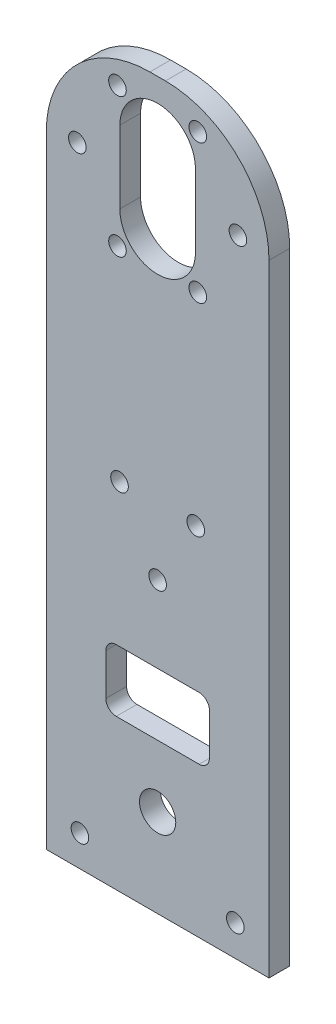
ISO-10303-21;
HEADER;
FILE_DESCRIPTION(('STEP AP214'),'2;1');
FILE_NAME('part.step','',(''),(''),'','','');
FILE_SCHEMA(('AUTOMOTIVE_DESIGN { 1 0 10303 214 1 1 1 1 }'));
ENDSEC;
DATA;
#1=APPLICATION_CONTEXT('core data for automotive mechanical design processes');
#2=APPLICATION_PROTOCOL_DEFINITION('international standard','automotive_design',2000,#1);
#3=PRODUCT_CONTEXT('',#1,'mechanical');
#4=PRODUCT('Part','Part','',(#3));
#5=PRODUCT_RELATED_PRODUCT_CATEGORY('part','',(#4));
#6=PRODUCT_DEFINITION_FORMATION('','',#4);
#7=PRODUCT_DEFINITION_CONTEXT('part definition',#1,'design');
#8=PRODUCT_DEFINITION('design','',#6,#7);
#9=PRODUCT_DEFINITION_SHAPE('','',#8);
#10=(LENGTH_UNIT() NAMED_UNIT(*) SI_UNIT(.MILLI.,.METRE.));
#11=(NAMED_UNIT(*) PLANE_ANGLE_UNIT() SI_UNIT($,.RADIAN.));
#12=(NAMED_UNIT(*) SI_UNIT($,.STERADIAN.) SOLID_ANGLE_UNIT());
#13=UNCERTAINTY_MEASURE_WITH_UNIT(LENGTH_MEASURE(1.E-05),#10,'distance_accuracy_value','');
#14=(GEOMETRIC_REPRESENTATION_CONTEXT(3) GLOBAL_UNCERTAINTY_ASSIGNED_CONTEXT((#13)) GLOBAL_UNIT_ASSIGNED_CONTEXT((#10,
#11,#12)) REPRESENTATION_CONTEXT('',''));
#15=CARTESIAN_POINT('',(0.,0.,0.));
#16=DIRECTION('',(0.,0.,1.));
#17=DIRECTION('',(1.,0.,0.));
#18=AXIS2_PLACEMENT_3D('',#15,#16,#17);
#19=CARTESIAN_POINT('',(0.,0.,4.));
#20=DIRECTION('',(0.,0.,1.));
#21=DIRECTION('',(1.,0.,0.));
#22=AXIS2_PLACEMENT_3D('',#19,#20,#21);
#23=PLANE('',#22);
#24=CARTESIAN_POINT('',(-0.99999999999988,-64.4016590441318,4.));
#25=DIRECTION('',(0.,0.,1.));
#26=DIRECTION('',(1.,0.,0.));
#27=AXIS2_PLACEMENT_3D('',#24,#25,#26);
#28=CIRCLE('',#27,1.70000000006136);
#29=CARTESIAN_POINT('',(0.700000000061478,-64.4016590441318,4.));
#30=VERTEX_POINT('',#29);
#31=EDGE_CURVE('E358',#30,#30,#28,.T.);
#32=ORIENTED_EDGE('',*,*,#31,.F.);
#33=EDGE_LOOP('',(#32));
#34=FACE_BOUND('',#33,.T.);
#35=CARTESIAN_POINT('',(6.36121593216787,-51.6516590441318,4.));
#36=DIRECTION('',(0.,0.,1.));
#37=DIRECTION('',(1.,0.,0.));
#38=AXIS2_PLACEMENT_3D('',#35,#36,#37);
#39=CIRCLE('',#38,1.70000000006138);
#40=CARTESIAN_POINT('',(8.06121593222925,-51.6516590441318,4.));
#41=VERTEX_POINT('',#40);
#42=EDGE_CURVE('E375',#41,#41,#39,.T.);
#43=ORIENTED_EDGE('',*,*,#42,.F.);
#44=EDGE_LOOP('',(#43));
#45=FACE_BOUND('',#44,.T.);
#46=CARTESIAN_POINT('',(-8.36121593216755,-51.6516590441317,4.));
#47=DIRECTION('',(0.,0.,1.));
#48=DIRECTION('',(1.,0.,0.));
#49=AXIS2_PLACEMENT_3D('',#46,#47,#48);
#50=CIRCLE('',#49,1.70000000006137);
#51=CARTESIAN_POINT('',(-6.66121593210618,-51.6516590441317,4.));
#52=VERTEX_POINT('',#51);
#53=EDGE_CURVE('E372',#52,#52,#50,.T.);
#54=ORIENTED_EDGE('',*,*,#53,.F.);
#55=EDGE_LOOP('',(#54));
#56=FACE_BOUND('',#55,.T.);
#57=DIRECTION('',(0.,1.,0.));
#58=VECTOR('',#57,1.);
#59=CARTESIAN_POINT('',(9.00000000000006,-89.2,4.));
#60=LINE('',#59,#58);
#61=CARTESIAN_POINT('',(9.00000000000006,-89.2,4.));
#62=VERTEX_POINT('',#61);
#63=CARTESIAN_POINT('',(9.00000000000006,-81.2,4.));
#64=VERTEX_POINT('',#63);
#65=EDGE_CURVE('E176',#62,#64,#60,.T.);
#66=ORIENTED_EDGE('',*,*,#65,.F.);
#67=CARTESIAN_POINT('',(7.00000000000005,-89.2,4.));
#68=DIRECTION('',(0.,0.,1.));
#69=DIRECTION('',(-1.,0.,0.));
#70=AXIS2_PLACEMENT_3D('',#67,#68,#69);
#71=CIRCLE('',#70,1.99999999999999);
#72=CARTESIAN_POINT('',(7.00000000000005,-91.2,4.));
#73=VERTEX_POINT('',#72);
#74=EDGE_CURVE('E166',#73,#62,#71,.T.);
#75=ORIENTED_EDGE('',*,*,#74,.F.);
#76=DIRECTION('',(1.,0.,0.));
#77=VECTOR('',#76,1.);
#78=CARTESIAN_POINT('',(-8.99999999999994,-91.2,4.));
#79=LINE('',#78,#77);
#80=CARTESIAN_POINT('',(-8.99999999999994,-91.2,4.));
#81=VERTEX_POINT('',#80);
#82=EDGE_CURVE('E204',#81,#73,#79,.T.);
#83=ORIENTED_EDGE('',*,*,#82,.F.);
#84=CARTESIAN_POINT('',(-8.99999999999994,-89.2,4.));
#85=DIRECTION('',(0.,0.,1.));
#86=DIRECTION('',(1.,0.,0.));
#87=AXIS2_PLACEMENT_3D('',#84,#85,#86);
#88=CIRCLE('',#87,1.99999999999999);
#89=CARTESIAN_POINT('',(-10.9999999999999,-89.2,4.));
#90=VERTEX_POINT('',#89);
#91=EDGE_CURVE('E201',#90,#81,#88,.T.);
#92=ORIENTED_EDGE('',*,*,#91,.F.);
#93=DIRECTION('',(0.,-1.,0.));
#94=VECTOR('',#93,1.);
#95=CARTESIAN_POINT('',(-10.9999999999999,-89.2,4.));
#96=LINE('',#95,#94);
#97=CARTESIAN_POINT('',(-11.,-81.2,4.));
#98=VERTEX_POINT('',#97);
#99=EDGE_CURVE('E199',#98,#90,#96,.T.);
#100=ORIENTED_EDGE('',*,*,#99,.F.);
#101=CARTESIAN_POINT('',(-8.99999999999994,-81.2,4.));
#102=DIRECTION('',(0.,0.,1.));
#103=DIRECTION('',(-1.,0.,0.));
#104=AXIS2_PLACEMENT_3D('',#101,#102,#103);
#105=CIRCLE('',#104,2.00000000000001);
#106=CARTESIAN_POINT('',(-8.99999999999994,-79.2,4.));
#107=VERTEX_POINT('',#106);
#108=EDGE_CURVE('E197',#107,#98,#105,.T.);
#109=ORIENTED_EDGE('',*,*,#108,.F.);
#110=DIRECTION('',(-1.,0.,0.));
#111=VECTOR('',#110,1.);
#112=CARTESIAN_POINT('',(-8.99999999999994,-79.2,4.));
#113=LINE('',#112,#111);
#114=CARTESIAN_POINT('',(7.00000000000005,-79.2,4.));
#115=VERTEX_POINT('',#114);
#116=EDGE_CURVE('E192',#115,#107,#113,.T.);
#117=ORIENTED_EDGE('',*,*,#116,.F.);
#118=CARTESIAN_POINT('',(7.00000000000005,-81.2,4.));
#119=DIRECTION('',(0.,0.,1.));
#120=DIRECTION('',(-1.,0.,0.));
#121=AXIS2_PLACEMENT_3D('',#118,#119,#120);
#122=CIRCLE('',#121,2.00000000000001);
#123=EDGE_CURVE('E190',#64,#115,#122,.T.);
#124=ORIENTED_EDGE('',*,*,#123,.F.);
#125=EDGE_LOOP('',(#66,#75,#83,#92,#100,#109,#117,#124));
#126=FACE_BOUND('',#125,.T.);
#127=DIRECTION('',(0.,-1.,0.));
#128=VECTOR('',#127,1.);
#129=CARTESIAN_POINT('',(-8.30000000000002,8.00000000000001,4.));
#130=LINE('',#129,#128);
#131=CARTESIAN_POINT('',(-8.30000000000002,8.00000000000001,4.));
#132=VERTEX_POINT('',#131);
#133=CARTESIAN_POINT('',(-8.30000000000005,-5.99999999999999,4.));
#134=VERTEX_POINT('',#133);
#135=EDGE_CURVE('E241',#132,#134,#130,.T.);
#136=ORIENTED_EDGE('',*,*,#135,.F.);
#137=CARTESIAN_POINT('',(-0.99999999999992,8.00000000000001,4.));
#138=DIRECTION('',(0.,0.,1.));
#139=DIRECTION('',(1.,0.,0.));
#140=AXIS2_PLACEMENT_3D('',#137,#138,#139);
#141=CIRCLE('',#140,7.30000000000008);
#142=CARTESIAN_POINT('',(6.30000000000013,8.00000000000001,4.));
#143=VERTEX_POINT('',#142);
#144=EDGE_CURVE('E239',#143,#132,#141,.T.);
#145=ORIENTED_EDGE('',*,*,#144,.F.);
#146=DIRECTION('',(0.,1.,0.));
#147=VECTOR('',#146,1.);
#148=CARTESIAN_POINT('',(6.30000000000013,8.00000000000001,4.));
#149=LINE('',#148,#147);
#150=CARTESIAN_POINT('',(6.30000000000014,-5.99999999999999,4.));
#151=VERTEX_POINT('',#150);
#152=EDGE_CURVE('E247',#151,#143,#149,.T.);
#153=ORIENTED_EDGE('',*,*,#152,.F.);
#154=CARTESIAN_POINT('',(-0.999999999999969,-5.99999999999999,4.));
#155=DIRECTION('',(0.,0.,1.));
#156=DIRECTION('',(1.,0.,0.));
#157=AXIS2_PLACEMENT_3D('',#154,#155,#156);
#158=CIRCLE('',#157,7.30000000000008);
#159=EDGE_CURVE('E244',#134,#151,#158,.T.);
#160=ORIENTED_EDGE('',*,*,#159,.F.);
#161=EDGE_LOOP('',(#136,#145,#153,#160));
#162=FACE_BOUND('',#161,.T.);
#163=CARTESIAN_POINT('',(-15.9999999999999,-114.2,4.));
#164=DIRECTION('',(0.,0.,1.));
#165=DIRECTION('',(1.,0.,0.));
#166=AXIS2_PLACEMENT_3D('',#163,#164,#165);
#167=CIRCLE('',#166,1.7);
#168=CARTESIAN_POINT('',(-14.2999999999999,-114.2,4.));
#169=VERTEX_POINT('',#168);
#170=EDGE_CURVE('E270',#169,#169,#167,.T.);
#171=ORIENTED_EDGE('',*,*,#170,.F.);
#172=EDGE_LOOP('',(#171));
#173=FACE_BOUND('',#172,.T.);
#174=CARTESIAN_POINT('',(14.5,0.999999999999956,4.));
#175=DIRECTION('',(0.,0.,1.));
#176=DIRECTION('',(1.,0.,0.));
#177=AXIS2_PLACEMENT_3D('',#174,#175,#176);
#178=CIRCLE('',#177,1.7);
#179=CARTESIAN_POINT('',(16.2,0.999999999999956,4.));
#180=VERTEX_POINT('',#179);
#181=EDGE_CURVE('E282',#180,#180,#178,.T.);
#182=ORIENTED_EDGE('',*,*,#181,.F.);
#183=EDGE_LOOP('',(#182));
#184=FACE_BOUND('',#183,.T.);
#185=CARTESIAN_POINT('',(-8.75435443094404,14.4259077905375,4.));
#186=DIRECTION('',(0.,0.,1.));
#187=DIRECTION('',(1.,0.,0.));
#188=AXIS2_PLACEMENT_3D('',#185,#186,#187);
#189=CIRCLE('',#188,1.7);
#190=CARTESIAN_POINT('',(-7.05435443094404,14.4259077905375,4.));
#191=VERTEX_POINT('',#190);
#192=EDGE_CURVE('E294',#191,#191,#189,.T.);
#193=ORIENTED_EDGE('',*,*,#192,.F.);
#194=EDGE_LOOP('',(#193));
#195=FACE_BOUND('',#194,.T.);
#196=CARTESIAN_POINT('',(-8.75435443094507,-12.4259077905363,4.));
#197=DIRECTION('',(0.,0.,1.));
#198=DIRECTION('',(1.,0.,0.));
#199=AXIS2_PLACEMENT_3D('',#196,#197,#198);
#200=CIRCLE('',#199,1.7);
#201=CARTESIAN_POINT('',(-7.05435443094506,-12.4259077905363,4.));
#202=VERTEX_POINT('',#201);
#203=EDGE_CURVE('E306',#202,#202,#200,.T.);
#204=ORIENTED_EDGE('',*,*,#203,.F.);
#205=EDGE_LOOP('',(#204));
#206=FACE_BOUND('',#205,.T.);
#207=DIRECTION('',(-1.,0.,0.));
#208=VECTOR('',#207,1.);
#209=CARTESIAN_POINT('',(20.5,19.8,4.));
#210=LINE('',#209,#208);
#211=CARTESIAN_POINT('',(0.500000000000028,19.8,4.));
#212=VERTEX_POINT('',#211);
#213=CARTESIAN_POINT('',(-2.49999999999993,19.8,4.));
#214=VERTEX_POINT('',#213);
#215=EDGE_CURVE('E324',#212,#214,#210,.T.);
#216=ORIENTED_EDGE('',*,*,#215,.T.);
#217=CARTESIAN_POINT('',(-2.49999999999992,-0.199999999999999,4.));
#218=DIRECTION('',(0.,0.,1.));
#219=DIRECTION('',(1.,0.,0.));
#220=AXIS2_PLACEMENT_3D('',#217,#218,#219);
#221=CIRCLE('',#220,20.);
#222=CARTESIAN_POINT('',(-22.4999999999999,-0.200000000000002,4.));
#223=VERTEX_POINT('',#222);
#224=EDGE_CURVE('E46',#214,#223,#221,.T.);
#225=ORIENTED_EDGE('',*,*,#224,.T.);
#226=DIRECTION('',(0.,-1.,0.));
#227=VECTOR('',#226,1.);
#228=CARTESIAN_POINT('',(-22.4999999999999,19.8,4.));
#229=LINE('',#228,#227);
#230=CARTESIAN_POINT('',(-22.4999999999999,-120.2,4.));
#231=VERTEX_POINT('',#230);
#232=EDGE_CURVE('E326',#223,#231,#229,.T.);
#233=ORIENTED_EDGE('',*,*,#232,.T.);
#234=DIRECTION('',(1.,0.,0.));
#235=VECTOR('',#234,1.);
#236=CARTESIAN_POINT('',(20.5,-120.2,4.));
#237=LINE('',#236,#235);
#238=CARTESIAN_POINT('',(20.5,-120.2,4.));
#239=VERTEX_POINT('',#238);
#240=EDGE_CURVE('E318',#231,#239,#237,.T.);
#241=ORIENTED_EDGE('',*,*,#240,.T.);
#242=DIRECTION('',(0.,1.,0.));
#243=VECTOR('',#242,1.);
#244=CARTESIAN_POINT('',(20.5,-120.2,4.));
#245=LINE('',#244,#243);
#246=CARTESIAN_POINT('',(20.5,-0.199999999999992,4.));
#247=VERTEX_POINT('',#246);
#248=EDGE_CURVE('E321',#239,#247,#245,.T.);
#249=ORIENTED_EDGE('',*,*,#248,.T.);
#250=CARTESIAN_POINT('',(0.500000000000032,-0.199999999999999,4.));
#251=DIRECTION('',(0.,0.,1.));
#252=DIRECTION('',(1.,0.,0.));
#253=AXIS2_PLACEMENT_3D('',#250,#251,#252);
#254=CIRCLE('',#253,20.);
#255=EDGE_CURVE('E352',#247,#212,#254,.T.);
#256=ORIENTED_EDGE('',*,*,#255,.T.);
#257=EDGE_LOOP('',(#216,#225,#233,#241,#249,#256));
#258=FACE_BOUND('',#257,.T.);
#259=CARTESIAN_POINT('',(6.74854852301807,-12.4259077905367,4.));
#260=DIRECTION('',(0.,0.,1.));
#261=DIRECTION('',(1.,0.,0.));
#262=AXIS2_PLACEMENT_3D('',#259,#260,#261);
#263=CIRCLE('',#262,1.7);
#264=CARTESIAN_POINT('',(8.44854852301807,-12.4259077905367,4.));
#265=VERTEX_POINT('',#264);
#266=EDGE_CURVE('E312',#265,#265,#263,.T.);
#267=ORIENTED_EDGE('',*,*,#266,.F.);
#268=EDGE_LOOP('',(#267));
#269=FACE_BOUND('',#268,.T.);
#270=CARTESIAN_POINT('',(-16.505805907926,1.00000000000084,4.));
#271=DIRECTION('',(0.,0.,1.));
#272=DIRECTION('',(1.,0.,0.));
#273=AXIS2_PLACEMENT_3D('',#270,#271,#272);
#274=CIRCLE('',#273,1.7);
#275=CARTESIAN_POINT('',(-14.805805907926,1.00000000000084,4.));
#276=VERTEX_POINT('',#275);
#277=EDGE_CURVE('E300',#276,#276,#274,.T.);
#278=ORIENTED_EDGE('',*,*,#277,.F.);
#279=EDGE_LOOP('',(#278));
#280=FACE_BOUND('',#279,.T.);
#281=CARTESIAN_POINT('',(6.74854852301912,14.4259077905371,4.));
#282=DIRECTION('',(0.,0.,1.));
#283=DIRECTION('',(1.,0.,0.));
#284=AXIS2_PLACEMENT_3D('',#281,#282,#283);
#285=CIRCLE('',#284,1.7);
#286=CARTESIAN_POINT('',(8.44854852301913,14.4259077905371,4.));
#287=VERTEX_POINT('',#286);
#288=EDGE_CURVE('E288',#287,#287,#285,.T.);
#289=ORIENTED_EDGE('',*,*,#288,.F.);
#290=EDGE_LOOP('',(#289));
#291=FACE_BOUND('',#290,.T.);
#292=CARTESIAN_POINT('',(14.0000000000001,-114.2,4.));
#293=DIRECTION('',(0.,0.,1.));
#294=DIRECTION('',(1.,0.,0.));
#295=AXIS2_PLACEMENT_3D('',#292,#293,#294);
#296=CIRCLE('',#295,1.7);
#297=CARTESIAN_POINT('',(15.7000000000001,-114.2,4.));
#298=VERTEX_POINT('',#297);
#299=EDGE_CURVE('E276',#298,#298,#296,.T.);
#300=ORIENTED_EDGE('',*,*,#299,.F.);
#301=EDGE_LOOP('',(#300));
#302=FACE_BOUND('',#301,.T.);
#303=CARTESIAN_POINT('',(-0.999999999999931,-103.2,4.));
#304=DIRECTION('',(0.,0.,1.));
#305=DIRECTION('',(1.,0.,0.));
#306=AXIS2_PLACEMENT_3D('',#303,#304,#305);
#307=CIRCLE('',#306,3.5);
#308=CARTESIAN_POINT('',(2.50000000000007,-103.2,4.));
#309=VERTEX_POINT('',#308);
#310=EDGE_CURVE('E208',#309,#309,#307,.T.);
#311=ORIENTED_EDGE('',*,*,#310,.F.);
#312=EDGE_LOOP('',(#311));
#313=FACE_BOUND('',#312,.T.);
#314=ADVANCED_FACE('F37',(#34,#45,#56,#126,#162,#173,#184,#195,#206,#258,#269,#280,#291,#302,
#313),#23,.T.);
#315=CARTESIAN_POINT('',(0.,0.,0.));
#316=DIRECTION('',(0.,0.,1.));
#317=DIRECTION('',(1.,0.,0.));
#318=AXIS2_PLACEMENT_3D('',#315,#316,#317);
#319=PLANE('',#318);
#320=CARTESIAN_POINT('',(-0.99999999999988,-64.4016590441318,0.));
#321=DIRECTION('',(0.,0.,1.));
#322=DIRECTION('',(1.,0.,0.));
#323=AXIS2_PLACEMENT_3D('',#320,#321,#322);
#324=CIRCLE('',#323,1.70000000006136);
#325=CARTESIAN_POINT('',(0.700000000061478,-64.4016590441318,0.));
#326=VERTEX_POINT('',#325);
#327=EDGE_CURVE('E41',#326,#326,#324,.T.);
#328=ORIENTED_EDGE('',*,*,#327,.T.);
#329=EDGE_LOOP('',(#328));
#330=FACE_BOUND('',#329,.T.);
#331=CARTESIAN_POINT('',(6.36121593216787,-51.6516590441318,0.));
#332=DIRECTION('',(0.,0.,1.));
#333=DIRECTION('',(1.,0.,0.));
#334=AXIS2_PLACEMENT_3D('',#331,#332,#333);
#335=CIRCLE('',#334,1.70000000006138);
#336=CARTESIAN_POINT('',(8.06121593222925,-51.6516590441318,0.));
#337=VERTEX_POINT('',#336);
#338=EDGE_CURVE('E357',#337,#337,#335,.T.);
#339=ORIENTED_EDGE('',*,*,#338,.T.);
#340=EDGE_LOOP('',(#339));
#341=FACE_BOUND('',#340,.T.);
#342=CARTESIAN_POINT('',(-8.36121593216755,-51.6516590441317,0.));
#343=DIRECTION('',(0.,0.,1.));
#344=DIRECTION('',(1.,0.,0.));
#345=AXIS2_PLACEMENT_3D('',#342,#343,#344);
#346=CIRCLE('',#345,1.70000000006137);
#347=CARTESIAN_POINT('',(-6.66121593210618,-51.6516590441317,0.));
#348=VERTEX_POINT('',#347);
#349=EDGE_CURVE('E355',#348,#348,#346,.T.);
#350=ORIENTED_EDGE('',*,*,#349,.T.);
#351=EDGE_LOOP('',(#350));
#352=FACE_BOUND('',#351,.T.);
#353=CARTESIAN_POINT('',(-0.99999999999992,8.00000000000001,0.));
#354=DIRECTION('',(0.,0.,1.));
#355=DIRECTION('',(1.,0.,0.));
#356=AXIS2_PLACEMENT_3D('',#353,#354,#355);
#357=CIRCLE('',#356,7.30000000000008);
#358=CARTESIAN_POINT('',(6.30000000000013,8.00000000000001,0.));
#359=VERTEX_POINT('',#358);
#360=CARTESIAN_POINT('',(-8.30000000000002,8.00000000000001,0.));
#361=VERTEX_POINT('',#360);
#362=EDGE_CURVE('E184',#359,#361,#357,.T.);
#363=ORIENTED_EDGE('',*,*,#362,.T.);
#364=DIRECTION('',(0.,-1.,0.));
#365=VECTOR('',#364,1.);
#366=CARTESIAN_POINT('',(-8.30000000000002,8.00000000000001,0.));
#367=LINE('',#366,#365);
#368=CARTESIAN_POINT('',(-8.30000000000005,-5.99999999999999,0.));
#369=VERTEX_POINT('',#368);
#370=EDGE_CURVE('E252',#361,#369,#367,.T.);
#371=ORIENTED_EDGE('',*,*,#370,.T.);
#372=CARTESIAN_POINT('',(-0.999999999999969,-5.99999999999999,0.));
#373=DIRECTION('',(0.,0.,1.));
#374=DIRECTION('',(1.,0.,0.));
#375=AXIS2_PLACEMENT_3D('',#372,#373,#374);
#376=CIRCLE('',#375,7.30000000000008);
#377=CARTESIAN_POINT('',(6.30000000000014,-5.99999999999999,0.));
#378=VERTEX_POINT('',#377);
#379=EDGE_CURVE('E255',#369,#378,#376,.T.);
#380=ORIENTED_EDGE('',*,*,#379,.T.);
#381=DIRECTION('',(0.,1.,0.));
#382=VECTOR('',#381,1.);
#383=CARTESIAN_POINT('',(6.30000000000013,8.00000000000001,0.));
#384=LINE('',#383,#382);
#385=EDGE_CURVE('E242',#378,#359,#384,.T.);
#386=ORIENTED_EDGE('',*,*,#385,.T.);
#387=EDGE_LOOP('',(#363,#371,#380,#386));
#388=FACE_BOUND('',#387,.T.);
#389=DIRECTION('',(0.,-1.,0.));
#390=VECTOR('',#389,1.);
#391=CARTESIAN_POINT('',(-22.4999999999999,19.8,0.));
#392=LINE('',#391,#390);
#393=CARTESIAN_POINT('',(-22.4999999999999,-0.200000000000002,0.));
#394=VERTEX_POINT('',#393);
#395=CARTESIAN_POINT('',(-22.4999999999999,-120.2,0.));
#396=VERTEX_POINT('',#395);
#397=EDGE_CURVE('E322',#394,#396,#392,.T.);
#398=ORIENTED_EDGE('',*,*,#397,.F.);
#399=CARTESIAN_POINT('',(-2.49999999999992,-0.199999999999999,0.));
#400=DIRECTION('',(0.,0.,1.));
#401=DIRECTION('',(1.,0.,0.));
#402=AXIS2_PLACEMENT_3D('',#399,#400,#401);
#403=CIRCLE('',#402,20.);
#404=CARTESIAN_POINT('',(-2.49999999999993,19.8,0.));
#405=VERTEX_POINT('',#404);
#406=EDGE_CURVE('E346',#394,#405,#403,.F.);
#407=ORIENTED_EDGE('',*,*,#406,.T.);
#408=DIRECTION('',(-1.,0.,0.));
#409=VECTOR('',#408,1.);
#410=CARTESIAN_POINT('',(20.5,19.8,0.));
#411=LINE('',#410,#409);
#412=CARTESIAN_POINT('',(0.500000000000028,19.8,0.));
#413=VERTEX_POINT('',#412);
#414=EDGE_CURVE('E333',#413,#405,#411,.T.);
#415=ORIENTED_EDGE('',*,*,#414,.F.);
#416=CARTESIAN_POINT('',(0.500000000000032,-0.199999999999999,0.));
#417=DIRECTION('',(0.,0.,1.));
#418=DIRECTION('',(1.,0.,0.));
#419=AXIS2_PLACEMENT_3D('',#416,#417,#418);
#420=CIRCLE('',#419,20.);
#421=CARTESIAN_POINT('',(20.5,-0.199999999999992,0.));
#422=VERTEX_POINT('',#421);
#423=EDGE_CURVE('E344',#413,#422,#420,.F.);
#424=ORIENTED_EDGE('',*,*,#423,.T.);
#425=DIRECTION('',(0.,1.,0.));
#426=VECTOR('',#425,1.);
#427=CARTESIAN_POINT('',(20.5,-120.2,0.));
#428=LINE('',#427,#426);
#429=CARTESIAN_POINT('',(20.5,-120.2,0.));
#430=VERTEX_POINT('',#429);
#431=EDGE_CURVE('E331',#430,#422,#428,.T.);
#432=ORIENTED_EDGE('',*,*,#431,.F.);
#433=DIRECTION('',(1.,0.,0.));
#434=VECTOR('',#433,1.);
#435=CARTESIAN_POINT('',(20.5,-120.2,0.));
#436=LINE('',#435,#434);
#437=EDGE_CURVE('E315',#396,#430,#436,.T.);
#438=ORIENTED_EDGE('',*,*,#437,.F.);
#439=EDGE_LOOP('',(#398,#407,#415,#424,#432,#438));
#440=FACE_BOUND('',#439,.T.);
#441=CARTESIAN_POINT('',(6.74854852301807,-12.4259077905367,0.));
#442=DIRECTION('',(0.,0.,1.));
#443=DIRECTION('',(1.,0.,0.));
#444=AXIS2_PLACEMENT_3D('',#441,#442,#443);
#445=CIRCLE('',#444,1.7);
#446=CARTESIAN_POINT('',(8.44854852301807,-12.4259077905367,0.));
#447=VERTEX_POINT('',#446);
#448=EDGE_CURVE('E309',#447,#447,#445,.T.);
#449=ORIENTED_EDGE('',*,*,#448,.T.);
#450=EDGE_LOOP('',(#449));
#451=FACE_BOUND('',#450,.T.);
#452=CARTESIAN_POINT('',(-8.75435443094507,-12.4259077905363,0.));
#453=DIRECTION('',(0.,0.,1.));
#454=DIRECTION('',(1.,0.,0.));
#455=AXIS2_PLACEMENT_3D('',#452,#453,#454);
#456=CIRCLE('',#455,1.7);
#457=CARTESIAN_POINT('',(-7.05435443094506,-12.4259077905363,0.));
#458=VERTEX_POINT('',#457);
#459=EDGE_CURVE('E303',#458,#458,#456,.T.);
#460=ORIENTED_EDGE('',*,*,#459,.T.);
#461=EDGE_LOOP('',(#460));
#462=FACE_BOUND('',#461,.T.);
#463=CARTESIAN_POINT('',(-16.505805907926,1.00000000000084,0.));
#464=DIRECTION('',(0.,0.,1.));
#465=DIRECTION('',(1.,0.,0.));
#466=AXIS2_PLACEMENT_3D('',#463,#464,#465);
#467=CIRCLE('',#466,1.7);
#468=CARTESIAN_POINT('',(-14.805805907926,1.00000000000084,0.));
#469=VERTEX_POINT('',#468);
#470=EDGE_CURVE('E297',#469,#469,#467,.T.);
#471=ORIENTED_EDGE('',*,*,#470,.T.);
#472=EDGE_LOOP('',(#471));
#473=FACE_BOUND('',#472,.T.);
#474=CARTESIAN_POINT('',(-8.75435443094404,14.4259077905375,0.));
#475=DIRECTION('',(0.,0.,1.));
#476=DIRECTION('',(1.,0.,0.));
#477=AXIS2_PLACEMENT_3D('',#474,#475,#476);
#478=CIRCLE('',#477,1.7);
#479=CARTESIAN_POINT('',(-7.05435443094404,14.4259077905375,0.));
#480=VERTEX_POINT('',#479);
#481=EDGE_CURVE('E291',#480,#480,#478,.T.);
#482=ORIENTED_EDGE('',*,*,#481,.T.);
#483=EDGE_LOOP('',(#482));
#484=FACE_BOUND('',#483,.T.);
#485=CARTESIAN_POINT('',(6.74854852301912,14.4259077905371,0.));
#486=DIRECTION('',(0.,0.,1.));
#487=DIRECTION('',(1.,0.,0.));
#488=AXIS2_PLACEMENT_3D('',#485,#486,#487);
#489=CIRCLE('',#488,1.7);
#490=CARTESIAN_POINT('',(8.44854852301913,14.4259077905371,0.));
#491=VERTEX_POINT('',#490);
#492=EDGE_CURVE('E285',#491,#491,#489,.T.);
#493=ORIENTED_EDGE('',*,*,#492,.T.);
#494=EDGE_LOOP('',(#493));
#495=FACE_BOUND('',#494,.T.);
#496=CARTESIAN_POINT('',(14.5,0.999999999999956,0.));
#497=DIRECTION('',(0.,0.,1.));
#498=DIRECTION('',(1.,0.,0.));
#499=AXIS2_PLACEMENT_3D('',#496,#497,#498);
#500=CIRCLE('',#499,1.7);
#501=CARTESIAN_POINT('',(16.2,0.999999999999956,0.));
#502=VERTEX_POINT('',#501);
#503=EDGE_CURVE('E279',#502,#502,#500,.T.);
#504=ORIENTED_EDGE('',*,*,#503,.T.);
#505=EDGE_LOOP('',(#504));
#506=FACE_BOUND('',#505,.T.);
#507=CARTESIAN_POINT('',(14.0000000000001,-114.2,0.));
#508=DIRECTION('',(0.,0.,1.));
#509=DIRECTION('',(1.,0.,0.));
#510=AXIS2_PLACEMENT_3D('',#507,#508,#509);
#511=CIRCLE('',#510,1.7);
#512=CARTESIAN_POINT('',(15.7000000000001,-114.2,0.));
#513=VERTEX_POINT('',#512);
#514=EDGE_CURVE('E273',#513,#513,#511,.T.);
#515=ORIENTED_EDGE('',*,*,#514,.T.);
#516=EDGE_LOOP('',(#515));
#517=FACE_BOUND('',#516,.T.);
#518=CARTESIAN_POINT('',(-15.9999999999999,-114.2,0.));
#519=DIRECTION('',(0.,0.,1.));
#520=DIRECTION('',(1.,0.,0.));
#521=AXIS2_PLACEMENT_3D('',#518,#519,#520);
#522=CIRCLE('',#521,1.7);
#523=CARTESIAN_POINT('',(-14.2999999999999,-114.2,0.));
#524=VERTEX_POINT('',#523);
#525=EDGE_CURVE('E269',#524,#524,#522,.T.);
#526=ORIENTED_EDGE('',*,*,#525,.T.);
#527=EDGE_LOOP('',(#526));
#528=FACE_BOUND('',#527,.T.);
#529=CARTESIAN_POINT('',(7.00000000000005,-89.2,0.));
#530=DIRECTION('',(0.,0.,1.));
#531=DIRECTION('',(-1.,0.,0.));
#532=AXIS2_PLACEMENT_3D('',#529,#530,#531);
#533=CIRCLE('',#532,1.99999999999999);
#534=CARTESIAN_POINT('',(7.00000000000005,-91.2,0.));
#535=VERTEX_POINT('',#534);
#536=CARTESIAN_POINT('',(9.00000000000006,-89.2,0.));
#537=VERTEX_POINT('',#536);
#538=EDGE_CURVE('E206',#535,#537,#533,.T.);
#539=ORIENTED_EDGE('',*,*,#538,.T.);
#540=DIRECTION('',(0.,1.,0.));
#541=VECTOR('',#540,1.);
#542=CARTESIAN_POINT('',(9.00000000000006,-89.2,0.));
#543=LINE('',#542,#541);
#544=CARTESIAN_POINT('',(9.00000000000006,-81.2,0.));
#545=VERTEX_POINT('',#544);
#546=EDGE_CURVE('E183',#537,#545,#543,.T.);
#547=ORIENTED_EDGE('',*,*,#546,.T.);
#548=CARTESIAN_POINT('',(7.00000000000005,-81.2,0.));
#549=DIRECTION('',(0.,0.,1.));
#550=DIRECTION('',(-1.,0.,0.));
#551=AXIS2_PLACEMENT_3D('',#548,#549,#550);
#552=CIRCLE('',#551,2.00000000000001);
#553=CARTESIAN_POINT('',(7.00000000000005,-79.2,0.));
#554=VERTEX_POINT('',#553);
#555=EDGE_CURVE('E210',#545,#554,#552,.T.);
#556=ORIENTED_EDGE('',*,*,#555,.T.);
#557=DIRECTION('',(-1.,0.,0.));
#558=VECTOR('',#557,1.);
#559=CARTESIAN_POINT('',(-8.99999999999994,-79.2,0.));
#560=LINE('',#559,#558);
#561=CARTESIAN_POINT('',(-8.99999999999994,-79.2,0.));
#562=VERTEX_POINT('',#561);
#563=EDGE_CURVE('E213',#554,#562,#560,.T.);
#564=ORIENTED_EDGE('',*,*,#563,.T.);
#565=CARTESIAN_POINT('',(-8.99999999999994,-81.2,0.));
#566=DIRECTION('',(0.,0.,1.));
#567=DIRECTION('',(-1.,0.,0.));
#568=AXIS2_PLACEMENT_3D('',#565,#566,#567);
#569=CIRCLE('',#568,2.00000000000001);
#570=CARTESIAN_POINT('',(-11.,-81.2,0.));
#571=VERTEX_POINT('',#570);
#572=EDGE_CURVE('E216',#562,#571,#569,.T.);
#573=ORIENTED_EDGE('',*,*,#572,.T.);
#574=DIRECTION('',(0.,-1.,0.));
#575=VECTOR('',#574,1.);
#576=CARTESIAN_POINT('',(-10.9999999999999,-89.2,0.));
#577=LINE('',#576,#575);
#578=CARTESIAN_POINT('',(-10.9999999999999,-89.2,0.));
#579=VERTEX_POINT('',#578);
#580=EDGE_CURVE('E219',#571,#579,#577,.T.);
#581=ORIENTED_EDGE('',*,*,#580,.T.);
#582=CARTESIAN_POINT('',(-8.99999999999994,-89.2,0.));
#583=DIRECTION('',(0.,0.,1.));
#584=DIRECTION('',(1.,0.,0.));
#585=AXIS2_PLACEMENT_3D('',#582,#583,#584);
#586=CIRCLE('',#585,1.99999999999999);
#587=CARTESIAN_POINT('',(-8.99999999999994,-91.2,0.));
#588=VERTEX_POINT('',#587);
#589=EDGE_CURVE('E222',#579,#588,#586,.T.);
#590=ORIENTED_EDGE('',*,*,#589,.T.);
#591=DIRECTION('',(1.,0.,0.));
#592=VECTOR('',#591,1.);
#593=CARTESIAN_POINT('',(-8.99999999999994,-91.2,0.));
#594=LINE('',#593,#592);
#595=EDGE_CURVE('E177',#588,#535,#594,.T.);
#596=ORIENTED_EDGE('',*,*,#595,.T.);
#597=EDGE_LOOP('',(#539,#547,#556,#564,#573,#581,#590,#596));
#598=FACE_BOUND('',#597,.T.);
#599=CARTESIAN_POINT('',(-0.999999999999931,-103.2,0.));
#600=DIRECTION('',(0.,0.,1.));
#601=DIRECTION('',(1.,0.,0.));
#602=AXIS2_PLACEMENT_3D('',#599,#600,#601);
#603=CIRCLE('',#602,3.5);
#604=CARTESIAN_POINT('',(2.50000000000007,-103.2,0.));
#605=VERTEX_POINT('',#604);
#606=EDGE_CURVE('E363',#605,#605,#603,.T.);
#607=ORIENTED_EDGE('',*,*,#606,.T.);
#608=EDGE_LOOP('',(#607));
#609=FACE_BOUND('',#608,.T.);
#610=ADVANCED_FACE('F386',(#330,#341,#352,#388,#440,#451,#462,#473,#484,#495,#506,#517,#528,
#598,#609),#319,.F.);
#611=CARTESIAN_POINT('',(20.5,-120.2,4.));
#612=DIRECTION('',(0.,1.,0.));
#613=DIRECTION('',(0.,0.,1.));
#614=AXIS2_PLACEMENT_3D('',#611,#612,#613);
#615=PLANE('',#614);
#616=ORIENTED_EDGE('',*,*,#437,.T.);
#617=DIRECTION('',(0.,0.,-1.));
#618=VECTOR('',#617,1.);
#619=CARTESIAN_POINT('',(20.5,-120.2,4.));
#620=LINE('',#619,#618);
#621=EDGE_CURVE('E338',#239,#430,#620,.T.);
#622=ORIENTED_EDGE('',*,*,#621,.F.);
#623=ORIENTED_EDGE('',*,*,#240,.F.);
#624=DIRECTION('',(0.,0.,-1.));
#625=VECTOR('',#624,1.);
#626=CARTESIAN_POINT('',(-22.4999999999999,-120.2,4.));
#627=LINE('',#626,#625);
#628=EDGE_CURVE('E328',#231,#396,#627,.T.);
#629=ORIENTED_EDGE('',*,*,#628,.T.);
#630=EDGE_LOOP('',(#616,#622,#623,#629));
#631=FACE_BOUND('',#630,.T.);
#632=ADVANCED_FACE('F401',(#631),#615,.F.);
#633=CARTESIAN_POINT('',(20.5,-120.2,4.));
#634=DIRECTION('',(-1.,0.,0.));
#635=DIRECTION('',(0.,-1.,0.));
#636=AXIS2_PLACEMENT_3D('',#633,#634,#635);
#637=PLANE('',#636);
#638=ORIENTED_EDGE('',*,*,#431,.T.);
#639=DIRECTION('',(0.,0.,-1.));
#640=VECTOR('',#639,1.);
#641=CARTESIAN_POINT('',(20.5,-0.199999999999992,4.));
#642=LINE('',#641,#640);
#643=EDGE_CURVE('E11',#422,#247,#642,.F.);
#644=ORIENTED_EDGE('',*,*,#643,.T.);
#645=ORIENTED_EDGE('',*,*,#248,.F.);
#646=ORIENTED_EDGE('',*,*,#621,.T.);
#647=EDGE_LOOP('',(#638,#644,#645,#646));
#648=FACE_BOUND('',#647,.T.);
#649=ADVANCED_FACE('F515',(#648),#637,.F.);
#650=CARTESIAN_POINT('',(20.5,19.8,4.));
#651=DIRECTION('',(0.,-1.,0.));
#652=DIRECTION('',(1.,0.,0.));
#653=AXIS2_PLACEMENT_3D('',#650,#651,#652);
#654=PLANE('',#653);
#655=ORIENTED_EDGE('',*,*,#414,.T.);
#656=DIRECTION('',(0.,0.,-1.));
#657=VECTOR('',#656,1.);
#658=CARTESIAN_POINT('',(-2.49999999999993,19.8,4.));
#659=LINE('',#658,#657);
#660=EDGE_CURVE('E60',#405,#214,#659,.F.);
#661=ORIENTED_EDGE('',*,*,#660,.T.);
#662=ORIENTED_EDGE('',*,*,#215,.F.);
#663=DIRECTION('',(0.,0.,-1.));
#664=VECTOR('',#663,1.);
#665=CARTESIAN_POINT('',(0.500000000000028,19.8,4.));
#666=LINE('',#665,#664);
#667=EDGE_CURVE('E348',#212,#413,#666,.T.);
#668=ORIENTED_EDGE('',*,*,#667,.T.);
#669=EDGE_LOOP('',(#655,#661,#662,#668));
#670=FACE_BOUND('',#669,.T.);
#671=ADVANCED_FACE('F511',(#670),#654,.F.);
#672=CARTESIAN_POINT('',(-22.4999999999999,19.8,4.));
#673=DIRECTION('',(1.,0.,0.));
#674=DIRECTION('',(0.,1.,0.));
#675=AXIS2_PLACEMENT_3D('',#672,#673,#674);
#676=PLANE('',#675);
#677=ORIENTED_EDGE('',*,*,#232,.F.);
#678=DIRECTION('',(0.,0.,-1.));
#679=VECTOR('',#678,1.);
#680=CARTESIAN_POINT('',(-22.4999999999999,-0.200000000000002,4.));
#681=LINE('',#680,#679);
#682=EDGE_CURVE('E341',#223,#394,#681,.T.);
#683=ORIENTED_EDGE('',*,*,#682,.T.);
#684=ORIENTED_EDGE('',*,*,#397,.T.);
#685=ORIENTED_EDGE('',*,*,#628,.F.);
#686=EDGE_LOOP('',(#677,#683,#684,#685));
#687=FACE_BOUND('',#686,.T.);
#688=ADVANCED_FACE('F506',(#687),#676,.F.);
#689=CARTESIAN_POINT('',(6.74854852301807,-12.4259077905367,4.));
#690=DIRECTION('',(0.,0.,-1.));
#691=DIRECTION('',(-1.,0.,0.));
#692=AXIS2_PLACEMENT_3D('',#689,#690,#691);
#693=CYLINDRICAL_SURFACE('',#692,1.7);
#694=ORIENTED_EDGE('',*,*,#266,.T.);
#695=EDGE_LOOP('',(#694));
#696=FACE_BOUND('',#695,.T.);
#697=ORIENTED_EDGE('',*,*,#448,.F.);
#698=EDGE_LOOP('',(#697));
#699=FACE_BOUND('',#698,.T.);
#700=ADVANCED_FACE('F503',(#696,#699),#693,.F.);
#701=CARTESIAN_POINT('',(-8.75435443094507,-12.4259077905363,4.));
#702=DIRECTION('',(0.,0.,-1.));
#703=DIRECTION('',(-1.,0.,0.));
#704=AXIS2_PLACEMENT_3D('',#701,#702,#703);
#705=CYLINDRICAL_SURFACE('',#704,1.7);
#706=ORIENTED_EDGE('',*,*,#203,.T.);
#707=EDGE_LOOP('',(#706));
#708=FACE_BOUND('',#707,.T.);
#709=ORIENTED_EDGE('',*,*,#459,.F.);
#710=EDGE_LOOP('',(#709));
#711=FACE_BOUND('',#710,.T.);
#712=ADVANCED_FACE('F499',(#708,#711),#705,.F.);
#713=CARTESIAN_POINT('',(-16.505805907926,1.00000000000084,4.));
#714=DIRECTION('',(0.,0.,-1.));
#715=DIRECTION('',(-1.,0.,0.));
#716=AXIS2_PLACEMENT_3D('',#713,#714,#715);
#717=CYLINDRICAL_SURFACE('',#716,1.7);
#718=ORIENTED_EDGE('',*,*,#277,.T.);
#719=EDGE_LOOP('',(#718));
#720=FACE_BOUND('',#719,.T.);
#721=ORIENTED_EDGE('',*,*,#470,.F.);
#722=EDGE_LOOP('',(#721));
#723=FACE_BOUND('',#722,.T.);
#724=ADVANCED_FACE('F495',(#720,#723),#717,.F.);
#725=CARTESIAN_POINT('',(-8.75435443094404,14.4259077905375,4.));
#726=DIRECTION('',(0.,0.,-1.));
#727=DIRECTION('',(-1.,0.,0.));
#728=AXIS2_PLACEMENT_3D('',#725,#726,#727);
#729=CYLINDRICAL_SURFACE('',#728,1.7);
#730=ORIENTED_EDGE('',*,*,#192,.T.);
#731=EDGE_LOOP('',(#730));
#732=FACE_BOUND('',#731,.T.);
#733=ORIENTED_EDGE('',*,*,#481,.F.);
#734=EDGE_LOOP('',(#733));
#735=FACE_BOUND('',#734,.T.);
#736=ADVANCED_FACE('F491',(#732,#735),#729,.F.);
#737=CARTESIAN_POINT('',(6.74854852301912,14.4259077905371,4.));
#738=DIRECTION('',(0.,0.,-1.));
#739=DIRECTION('',(-1.,0.,0.));
#740=AXIS2_PLACEMENT_3D('',#737,#738,#739);
#741=CYLINDRICAL_SURFACE('',#740,1.7);
#742=ORIENTED_EDGE('',*,*,#288,.T.);
#743=EDGE_LOOP('',(#742));
#744=FACE_BOUND('',#743,.T.);
#745=ORIENTED_EDGE('',*,*,#492,.F.);
#746=EDGE_LOOP('',(#745));
#747=FACE_BOUND('',#746,.T.);
#748=ADVANCED_FACE('F487',(#744,#747),#741,.F.);
#749=CARTESIAN_POINT('',(14.5,0.999999999999956,4.));
#750=DIRECTION('',(0.,0.,-1.));
#751=DIRECTION('',(-1.,0.,0.));
#752=AXIS2_PLACEMENT_3D('',#749,#750,#751);
#753=CYLINDRICAL_SURFACE('',#752,1.7);
#754=ORIENTED_EDGE('',*,*,#181,.T.);
#755=EDGE_LOOP('',(#754));
#756=FACE_BOUND('',#755,.T.);
#757=ORIENTED_EDGE('',*,*,#503,.F.);
#758=EDGE_LOOP('',(#757));
#759=FACE_BOUND('',#758,.T.);
#760=ADVANCED_FACE('F483',(#756,#759),#753,.F.);
#761=CARTESIAN_POINT('',(14.0000000000001,-114.2,4.));
#762=DIRECTION('',(0.,0.,-1.));
#763=DIRECTION('',(-1.,0.,0.));
#764=AXIS2_PLACEMENT_3D('',#761,#762,#763);
#765=CYLINDRICAL_SURFACE('',#764,1.7);
#766=ORIENTED_EDGE('',*,*,#299,.T.);
#767=EDGE_LOOP('',(#766));
#768=FACE_BOUND('',#767,.T.);
#769=ORIENTED_EDGE('',*,*,#514,.F.);
#770=EDGE_LOOP('',(#769));
#771=FACE_BOUND('',#770,.T.);
#772=ADVANCED_FACE('F479',(#768,#771),#765,.F.);
#773=CARTESIAN_POINT('',(-15.9999999999999,-114.2,4.));
#774=DIRECTION('',(0.,0.,-1.));
#775=DIRECTION('',(-1.,0.,0.));
#776=AXIS2_PLACEMENT_3D('',#773,#774,#775);
#777=CYLINDRICAL_SURFACE('',#776,1.7);
#778=ORIENTED_EDGE('',*,*,#170,.T.);
#779=EDGE_LOOP('',(#778));
#780=FACE_BOUND('',#779,.T.);
#781=ORIENTED_EDGE('',*,*,#525,.F.);
#782=EDGE_LOOP('',(#781));
#783=FACE_BOUND('',#782,.T.);
#784=ADVANCED_FACE('F475',(#780,#783),#777,.F.);
#785=CARTESIAN_POINT('',(-0.99999999999992,8.00000000000001,4.));
#786=DIRECTION('',(0.,0.,-1.));
#787=DIRECTION('',(-1.,0.,0.));
#788=AXIS2_PLACEMENT_3D('',#785,#786,#787);
#789=CYLINDRICAL_SURFACE('',#788,7.30000000000008);
#790=ORIENTED_EDGE('',*,*,#362,.F.);
#791=DIRECTION('',(0.,0.,-1.));
#792=VECTOR('',#791,1.);
#793=CARTESIAN_POINT('',(6.30000000000013,8.00000000000001,4.));
#794=LINE('',#793,#792);
#795=EDGE_CURVE('E249',#143,#359,#794,.T.);
#796=ORIENTED_EDGE('',*,*,#795,.F.);
#797=ORIENTED_EDGE('',*,*,#144,.T.);
#798=DIRECTION('',(0.,0.,-1.));
#799=VECTOR('',#798,1.);
#800=CARTESIAN_POINT('',(-8.30000000000002,8.00000000000001,4.));
#801=LINE('',#800,#799);
#802=EDGE_CURVE('E266',#132,#361,#801,.T.);
#803=ORIENTED_EDGE('',*,*,#802,.T.);
#804=EDGE_LOOP('',(#790,#796,#797,#803));
#805=FACE_BOUND('',#804,.T.);
#806=ADVANCED_FACE('F471',(#805),#789,.F.);
#807=CARTESIAN_POINT('',(-8.30000000000002,8.00000000000001,4.));
#808=DIRECTION('',(1.,0.,0.));
#809=DIRECTION('',(0.,1.,0.));
#810=AXIS2_PLACEMENT_3D('',#807,#808,#809);
#811=PLANE('',#810);
#812=ORIENTED_EDGE('',*,*,#370,.F.);
#813=ORIENTED_EDGE('',*,*,#802,.F.);
#814=ORIENTED_EDGE('',*,*,#135,.T.);
#815=DIRECTION('',(0.,0.,-1.));
#816=VECTOR('',#815,1.);
#817=CARTESIAN_POINT('',(-8.30000000000005,-5.99999999999999,4.));
#818=LINE('',#817,#816);
#819=EDGE_CURVE('E264',#134,#369,#818,.T.);
#820=ORIENTED_EDGE('',*,*,#819,.T.);
#821=EDGE_LOOP('',(#812,#813,#814,#820));
#822=FACE_BOUND('',#821,.T.);
#823=ADVANCED_FACE('F467',(#822),#811,.T.);
#824=CARTESIAN_POINT('',(-0.999999999999969,-5.99999999999999,4.));
#825=DIRECTION('',(0.,0.,-1.));
#826=DIRECTION('',(-1.,0.,0.));
#827=AXIS2_PLACEMENT_3D('',#824,#825,#826);
#828=CYLINDRICAL_SURFACE('',#827,7.30000000000008);
#829=ORIENTED_EDGE('',*,*,#379,.F.);
#830=ORIENTED_EDGE('',*,*,#819,.F.);
#831=ORIENTED_EDGE('',*,*,#159,.T.);
#832=DIRECTION('',(0.,0.,-1.));
#833=VECTOR('',#832,1.);
#834=CARTESIAN_POINT('',(6.30000000000014,-5.99999999999999,4.));
#835=LINE('',#834,#833);
#836=EDGE_CURVE('E262',#151,#378,#835,.T.);
#837=ORIENTED_EDGE('',*,*,#836,.T.);
#838=EDGE_LOOP('',(#829,#830,#831,#837));
#839=FACE_BOUND('',#838,.T.);
#840=ADVANCED_FACE('F463',(#839),#828,.F.);
#841=CARTESIAN_POINT('',(6.30000000000013,8.00000000000001,4.));
#842=DIRECTION('',(-1.,0.,0.));
#843=DIRECTION('',(0.,-1.,0.));
#844=AXIS2_PLACEMENT_3D('',#841,#842,#843);
#845=PLANE('',#844);
#846=ORIENTED_EDGE('',*,*,#385,.F.);
#847=ORIENTED_EDGE('',*,*,#836,.F.);
#848=ORIENTED_EDGE('',*,*,#152,.T.);
#849=ORIENTED_EDGE('',*,*,#795,.T.);
#850=EDGE_LOOP('',(#846,#847,#848,#849));
#851=FACE_BOUND('',#850,.T.);
#852=ADVANCED_FACE('F460',(#851),#845,.T.);
#853=CARTESIAN_POINT('',(7.00000000000005,-89.2,4.));
#854=DIRECTION('',(0.,0.,-1.));
#855=DIRECTION('',(-1.,0.,0.));
#856=AXIS2_PLACEMENT_3D('',#853,#854,#855);
#857=CYLINDRICAL_SURFACE('',#856,1.99999999999999);
#858=ORIENTED_EDGE('',*,*,#538,.F.);
#859=DIRECTION('',(0.,0.,-1.));
#860=VECTOR('',#859,1.);
#861=CARTESIAN_POINT('',(7.00000000000005,-91.2,4.));
#862=LINE('',#861,#860);
#863=EDGE_CURVE('E172',#73,#535,#862,.T.);
#864=ORIENTED_EDGE('',*,*,#863,.F.);
#865=ORIENTED_EDGE('',*,*,#74,.T.);
#866=DIRECTION('',(0.,0.,-1.));
#867=VECTOR('',#866,1.);
#868=CARTESIAN_POINT('',(9.00000000000006,-89.2,4.));
#869=LINE('',#868,#867);
#870=EDGE_CURVE('E169',#62,#537,#869,.T.);
#871=ORIENTED_EDGE('',*,*,#870,.T.);
#872=EDGE_LOOP('',(#858,#864,#865,#871));
#873=FACE_BOUND('',#872,.T.);
#874=ADVANCED_FACE('F168',(#873),#857,.F.);
#875=CARTESIAN_POINT('',(9.00000000000006,-89.2,4.));
#876=DIRECTION('',(-1.,0.,0.));
#877=DIRECTION('',(0.,0.,1.));
#878=AXIS2_PLACEMENT_3D('',#875,#876,#877);
#879=PLANE('',#878);
#880=ORIENTED_EDGE('',*,*,#546,.F.);
#881=ORIENTED_EDGE('',*,*,#870,.F.);
#882=ORIENTED_EDGE('',*,*,#65,.T.);
#883=DIRECTION('',(0.,0.,-1.));
#884=VECTOR('',#883,1.);
#885=CARTESIAN_POINT('',(9.00000000000006,-81.2,4.));
#886=LINE('',#885,#884);
#887=EDGE_CURVE('E185',#64,#545,#886,.T.);
#888=ORIENTED_EDGE('',*,*,#887,.T.);
#889=EDGE_LOOP('',(#880,#881,#882,#888));
#890=FACE_BOUND('',#889,.T.);
#891=ADVANCED_FACE('F180',(#890),#879,.T.);
#892=CARTESIAN_POINT('',(7.00000000000005,-81.2,4.));
#893=DIRECTION('',(0.,0.,-1.));
#894=DIRECTION('',(-1.,0.,0.));
#895=AXIS2_PLACEMENT_3D('',#892,#893,#894);
#896=CYLINDRICAL_SURFACE('',#895,2.00000000000001);
#897=ORIENTED_EDGE('',*,*,#555,.F.);
#898=ORIENTED_EDGE('',*,*,#887,.F.);
#899=ORIENTED_EDGE('',*,*,#123,.T.);
#900=DIRECTION('',(0.,0.,-1.));
#901=VECTOR('',#900,1.);
#902=CARTESIAN_POINT('',(7.00000000000005,-79.2,4.));
#903=LINE('',#902,#901);
#904=EDGE_CURVE('E236',#115,#554,#903,.T.);
#905=ORIENTED_EDGE('',*,*,#904,.T.);
#906=EDGE_LOOP('',(#897,#898,#899,#905));
#907=FACE_BOUND('',#906,.T.);
#908=ADVANCED_FACE('F447',(#907),#896,.F.);
#909=CARTESIAN_POINT('',(-8.99999999999994,-79.2,4.));
#910=DIRECTION('',(0.,-1.,0.));
#911=DIRECTION('',(0.,0.,-1.));
#912=AXIS2_PLACEMENT_3D('',#909,#910,#911);
#913=PLANE('',#912);
#914=ORIENTED_EDGE('',*,*,#563,.F.);
#915=ORIENTED_EDGE('',*,*,#904,.F.);
#916=ORIENTED_EDGE('',*,*,#116,.T.);
#917=DIRECTION('',(0.,0.,-1.));
#918=VECTOR('',#917,1.);
#919=CARTESIAN_POINT('',(-8.99999999999994,-79.2,4.));
#920=LINE('',#919,#918);
#921=EDGE_CURVE('E234',#107,#562,#920,.T.);
#922=ORIENTED_EDGE('',*,*,#921,.T.);
#923=EDGE_LOOP('',(#914,#915,#916,#922));
#924=FACE_BOUND('',#923,.T.);
#925=ADVANCED_FACE('F444',(#924),#913,.T.);
#926=CARTESIAN_POINT('',(-8.99999999999994,-81.2,4.));
#927=DIRECTION('',(0.,0.,-1.));
#928=DIRECTION('',(-1.,0.,0.));
#929=AXIS2_PLACEMENT_3D('',#926,#927,#928);
#930=CYLINDRICAL_SURFACE('',#929,2.00000000000001);
#931=ORIENTED_EDGE('',*,*,#572,.F.);
#932=ORIENTED_EDGE('',*,*,#921,.F.);
#933=ORIENTED_EDGE('',*,*,#108,.T.);
#934=DIRECTION('',(0.,0.,-1.));
#935=VECTOR('',#934,1.);
#936=CARTESIAN_POINT('',(-11.,-81.2,4.));
#937=LINE('',#936,#935);
#938=EDGE_CURVE('E232',#98,#571,#937,.T.);
#939=ORIENTED_EDGE('',*,*,#938,.T.);
#940=EDGE_LOOP('',(#931,#932,#933,#939));
#941=FACE_BOUND('',#940,.T.);
#942=ADVANCED_FACE('F439',(#941),#930,.F.);
#943=CARTESIAN_POINT('',(-10.9999999999999,-89.2,4.));
#944=DIRECTION('',(1.,0.,0.));
#945=DIRECTION('',(0.,0.,-1.));
#946=AXIS2_PLACEMENT_3D('',#943,#944,#945);
#947=PLANE('',#946);
#948=ORIENTED_EDGE('',*,*,#580,.F.);
#949=ORIENTED_EDGE('',*,*,#938,.F.);
#950=ORIENTED_EDGE('',*,*,#99,.T.);
#951=DIRECTION('',(0.,0.,-1.));
#952=VECTOR('',#951,1.);
#953=CARTESIAN_POINT('',(-10.9999999999999,-89.2,4.));
#954=LINE('',#953,#952);
#955=EDGE_CURVE('E230',#90,#579,#954,.T.);
#956=ORIENTED_EDGE('',*,*,#955,.T.);
#957=EDGE_LOOP('',(#948,#949,#950,#956));
#958=FACE_BOUND('',#957,.T.);
#959=ADVANCED_FACE('F435',(#958),#947,.T.);
#960=CARTESIAN_POINT('',(-8.99999999999994,-89.2,4.));
#961=DIRECTION('',(0.,0.,-1.));
#962=DIRECTION('',(-1.,0.,0.));
#963=AXIS2_PLACEMENT_3D('',#960,#961,#962);
#964=CYLINDRICAL_SURFACE('',#963,1.99999999999999);
#965=ORIENTED_EDGE('',*,*,#589,.F.);
#966=ORIENTED_EDGE('',*,*,#955,.F.);
#967=ORIENTED_EDGE('',*,*,#91,.T.);
#968=DIRECTION('',(0.,0.,-1.));
#969=VECTOR('',#968,1.);
#970=CARTESIAN_POINT('',(-8.99999999999994,-91.2,4.));
#971=LINE('',#970,#969);
#972=EDGE_CURVE('E228',#81,#588,#971,.T.);
#973=ORIENTED_EDGE('',*,*,#972,.T.);
#974=EDGE_LOOP('',(#965,#966,#967,#973));
#975=FACE_BOUND('',#974,.T.);
#976=ADVANCED_FACE('F432',(#975),#964,.F.);
#977=CARTESIAN_POINT('',(-8.99999999999994,-91.2,4.));
#978=DIRECTION('',(0.,1.,0.));
#979=DIRECTION('',(0.,0.,1.));
#980=AXIS2_PLACEMENT_3D('',#977,#978,#979);
#981=PLANE('',#980);
#982=ORIENTED_EDGE('',*,*,#595,.F.);
#983=ORIENTED_EDGE('',*,*,#972,.F.);
#984=ORIENTED_EDGE('',*,*,#82,.T.);
#985=ORIENTED_EDGE('',*,*,#863,.T.);
#986=EDGE_LOOP('',(#982,#983,#984,#985));
#987=FACE_BOUND('',#986,.T.);
#988=ADVANCED_FACE('F425',(#987),#981,.T.);
#989=CARTESIAN_POINT('',(-0.999999999999931,-103.2,4.));
#990=DIRECTION('',(0.,0.,-1.));
#991=DIRECTION('',(-1.,0.,0.));
#992=AXIS2_PLACEMENT_3D('',#989,#990,#991);
#993=CYLINDRICAL_SURFACE('',#992,3.5);
#994=ORIENTED_EDGE('',*,*,#310,.T.);
#995=EDGE_LOOP('',(#994));
#996=FACE_BOUND('',#995,.T.);
#997=ORIENTED_EDGE('',*,*,#606,.F.);
#998=EDGE_LOOP('',(#997));
#999=FACE_BOUND('',#998,.T.);
#1000=ADVANCED_FACE('F522',(#996,#999),#993,.F.);
#1001=CARTESIAN_POINT('',(-2.49999999999992,-0.199999999999999,4.));
#1002=DIRECTION('',(0.,0.,-1.));
#1003=DIRECTION('',(-1.,0.,0.));
#1004=AXIS2_PLACEMENT_3D('',#1001,#1002,#1003);
#1005=CYLINDRICAL_SURFACE('',#1004,20.);
#1006=ORIENTED_EDGE('',*,*,#224,.F.);
#1007=ORIENTED_EDGE('',*,*,#660,.F.);
#1008=ORIENTED_EDGE('',*,*,#406,.F.);
#1009=ORIENTED_EDGE('',*,*,#682,.F.);
#1010=EDGE_LOOP('',(#1006,#1007,#1008,#1009));
#1011=FACE_BOUND('',#1010,.T.);
#1012=ADVANCED_FACE('F520',(#1011),#1005,.T.);
#1013=CARTESIAN_POINT('',(0.500000000000032,-0.199999999999999,4.));
#1014=DIRECTION('',(0.,0.,-1.));
#1015=DIRECTION('',(-1.,0.,0.));
#1016=AXIS2_PLACEMENT_3D('',#1013,#1014,#1015);
#1017=CYLINDRICAL_SURFACE('',#1016,20.);
#1018=ORIENTED_EDGE('',*,*,#255,.F.);
#1019=ORIENTED_EDGE('',*,*,#643,.F.);
#1020=ORIENTED_EDGE('',*,*,#423,.F.);
#1021=ORIENTED_EDGE('',*,*,#667,.F.);
#1022=EDGE_LOOP('',(#1018,#1019,#1020,#1021));
#1023=FACE_BOUND('',#1022,.T.);
#1024=ADVANCED_FACE('F39',(#1023),#1017,.T.);
#1025=CARTESIAN_POINT('',(-8.36121593216755,-51.6516590441317,-6.));
#1026=DIRECTION('',(0.,0.,1.));
#1027=DIRECTION('',(1.,0.,0.));
#1028=AXIS2_PLACEMENT_3D('',#1025,#1026,#1027);
#1029=CYLINDRICAL_SURFACE('',#1028,1.70000000006137);
#1030=ORIENTED_EDGE('',*,*,#53,.T.);
#1031=EDGE_LOOP('',(#1030));
#1032=FACE_BOUND('',#1031,.T.);
#1033=ORIENTED_EDGE('',*,*,#349,.F.);
#1034=EDGE_LOOP('',(#1033));
#1035=FACE_BOUND('',#1034,.T.);
#1036=ADVANCED_FACE('F392',(#1032,#1035),#1029,.F.);
#1037=CARTESIAN_POINT('',(6.36121593216787,-51.6516590441318,-6.));
#1038=DIRECTION('',(0.,0.,1.));
#1039=DIRECTION('',(1.,0.,0.));
#1040=AXIS2_PLACEMENT_3D('',#1037,#1038,#1039);
#1041=CYLINDRICAL_SURFACE('',#1040,1.70000000006138);
#1042=ORIENTED_EDGE('',*,*,#42,.T.);
#1043=EDGE_LOOP('',(#1042));
#1044=FACE_BOUND('',#1043,.T.);
#1045=ORIENTED_EDGE('',*,*,#338,.F.);
#1046=EDGE_LOOP('',(#1045));
#1047=FACE_BOUND('',#1046,.T.);
#1048=ADVANCED_FACE('F395',(#1044,#1047),#1041,.F.);
#1049=CARTESIAN_POINT('',(-0.99999999999988,-64.4016590441318,-6.));
#1050=DIRECTION('',(0.,0.,1.));
#1051=DIRECTION('',(1.,0.,0.));
#1052=AXIS2_PLACEMENT_3D('',#1049,#1050,#1051);
#1053=CYLINDRICAL_SURFACE('',#1052,1.70000000006136);
#1054=ORIENTED_EDGE('',*,*,#31,.T.);
#1055=EDGE_LOOP('',(#1054));
#1056=FACE_BOUND('',#1055,.T.);
#1057=ORIENTED_EDGE('',*,*,#327,.F.);
#1058=EDGE_LOOP('',(#1057));
#1059=FACE_BOUND('',#1058,.T.);
#1060=ADVANCED_FACE('F381',(#1056,#1059),#1053,.F.);
#1061=CLOSED_SHELL('',(#314,#610,#632,#649,#671,#688,#700,#712,#724,#736,#748,#760,#772,#784,
#806,#823,#840,#852,#874,#891,#908,#925,#942,#959,#976,#988,#1000,#1012,#1024,#1036,#1048,#1060));
#1062=MANIFOLD_SOLID_BREP('B2',#1061);
#1063=ADVANCED_BREP_SHAPE_REPRESENTATION('',(#18,#1062),#14);
#1064=SHAPE_DEFINITION_REPRESENTATION(#9,#1063);
ENDSEC;
END-ISO-10303-21;
